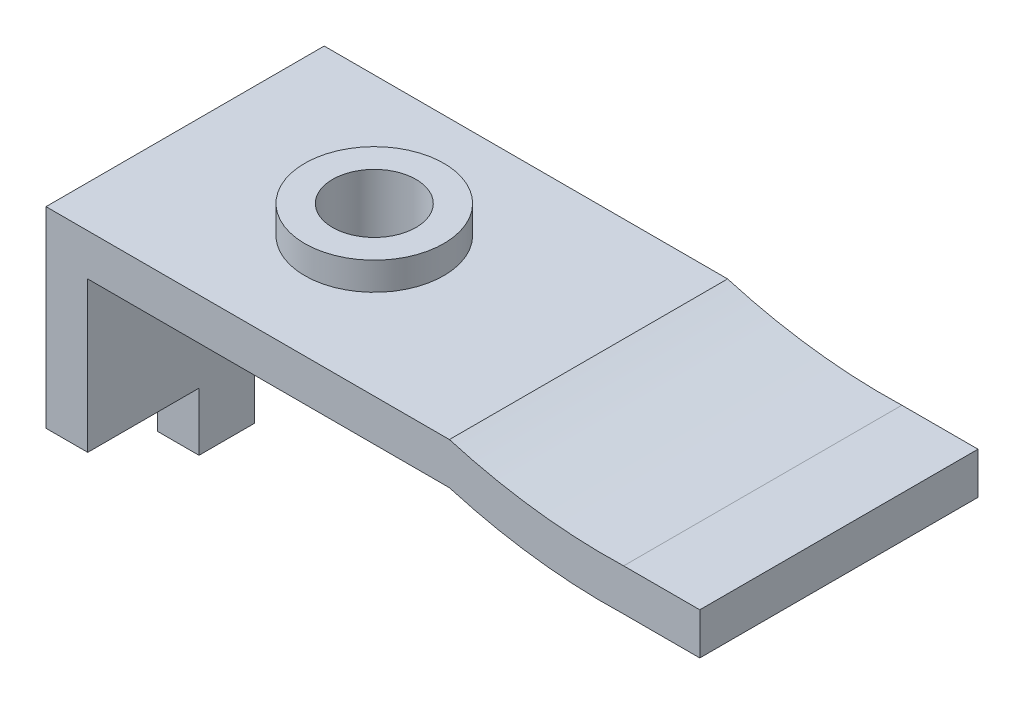
ISO-10303-21;
HEADER;
FILE_DESCRIPTION(('STEP AP214'),'2;1');
FILE_NAME('part.step','',(''),(''),'','','');
FILE_SCHEMA(('AUTOMOTIVE_DESIGN { 1 0 10303 214 1 1 1 1 }'));
ENDSEC;
DATA;
#1=APPLICATION_CONTEXT('core data for automotive mechanical design processes');
#2=APPLICATION_PROTOCOL_DEFINITION('international standard','automotive_design',2000,#1);
#3=PRODUCT_CONTEXT('',#1,'mechanical');
#4=PRODUCT('Part','Part','',(#3));
#5=PRODUCT_RELATED_PRODUCT_CATEGORY('part','',(#4));
#6=PRODUCT_DEFINITION_FORMATION('','',#4);
#7=PRODUCT_DEFINITION_CONTEXT('part definition',#1,'design');
#8=PRODUCT_DEFINITION('design','',#6,#7);
#9=PRODUCT_DEFINITION_SHAPE('','',#8);
#10=(LENGTH_UNIT() NAMED_UNIT(*) SI_UNIT(.MILLI.,.METRE.));
#11=(NAMED_UNIT(*) PLANE_ANGLE_UNIT() SI_UNIT($,.RADIAN.));
#12=(NAMED_UNIT(*) SI_UNIT($,.STERADIAN.) SOLID_ANGLE_UNIT());
#13=UNCERTAINTY_MEASURE_WITH_UNIT(LENGTH_MEASURE(1.E-05),#10,'distance_accuracy_value','');
#14=(GEOMETRIC_REPRESENTATION_CONTEXT(3) GLOBAL_UNCERTAINTY_ASSIGNED_CONTEXT((#13)) GLOBAL_UNIT_ASSIGNED_CONTEXT((#10,
#11,#12)) REPRESENTATION_CONTEXT('',''));
#15=CARTESIAN_POINT('',(0.,0.,0.));
#16=DIRECTION('',(0.,0.,1.));
#17=DIRECTION('',(1.,0.,0.));
#18=AXIS2_PLACEMENT_3D('',#15,#16,#17);
#19=CARTESIAN_POINT('',(-17.31178038599,-2.3,0.));
#20=DIRECTION('',(1.,0.,0.));
#21=DIRECTION('',(0.,0.,-1.));
#22=AXIS2_PLACEMENT_3D('',#19,#20,#21);
#23=PLANE('',#22);
#24=DIRECTION('',(0.,0.,-1.));
#25=VECTOR('',#24,1.);
#26=CARTESIAN_POINT('',(-17.31178038599,-2.3,0.));
#27=LINE('',#26,#25);
#28=CARTESIAN_POINT('',(-17.31178038599,-2.3,0.));
#29=VERTEX_POINT('',#28);
#30=CARTESIAN_POINT('',(-17.31178038599,-2.3,10.));
#31=VERTEX_POINT('',#30);
#32=EDGE_CURVE('E174',#29,#31,#27,.F.);
#33=ORIENTED_EDGE('',*,*,#32,.F.);
#34=DIRECTION('',(0.,1.,0.));
#35=VECTOR('',#34,1.);
#36=CARTESIAN_POINT('',(-17.31178038599,-2.3,0.));
#37=LINE('',#36,#35);
#38=CARTESIAN_POINT('',(-17.31178038599,-0.8,0.));
#39=VERTEX_POINT('',#38);
#40=EDGE_CURVE('E134',#29,#39,#37,.T.);
#41=ORIENTED_EDGE('',*,*,#40,.T.);
#42=DIRECTION('',(0.,0.,1.));
#43=VECTOR('',#42,1.);
#44=CARTESIAN_POINT('',(-17.31178038599,-0.8,0.));
#45=LINE('',#44,#43);
#46=CARTESIAN_POINT('',(-17.31178038599,-0.8,10.));
#47=VERTEX_POINT('',#46);
#48=EDGE_CURVE('E137',#47,#39,#45,.F.);
#49=ORIENTED_EDGE('',*,*,#48,.F.);
#50=DIRECTION('',(0.,1.,0.));
#51=VECTOR('',#50,1.);
#52=CARTESIAN_POINT('',(-17.31178038599,-2.3,10.));
#53=LINE('',#52,#51);
#54=EDGE_CURVE('E121',#47,#31,#53,.F.);
#55=ORIENTED_EDGE('',*,*,#54,.T.);
#56=EDGE_LOOP('',(#33,#41,#49,#55));
#57=FACE_BOUND('',#56,.T.);
#58=ADVANCED_FACE('F17',(#57),#23,.T.);
#59=CARTESIAN_POINT('',(-34.01178038599,0.,5.));
#60=DIRECTION('',(0.,1.,0.));
#61=DIRECTION('',(0.,0.,1.));
#62=AXIS2_PLACEMENT_3D('',#59,#60,#61);
#63=CYLINDRICAL_SURFACE('',#62,1.5);
#64=CARTESIAN_POINT('',(-34.01178038599,1.,5.));
#65=DIRECTION('',(0.,1.,0.));
#66=DIRECTION('',(0.,0.,1.));
#67=AXIS2_PLACEMENT_3D('',#64,#65,#66);
#68=CIRCLE('',#67,1.5);
#69=CARTESIAN_POINT('',(-34.01178038599,1.,6.5));
#70=VERTEX_POINT('',#69);
#71=EDGE_CURVE('E141',#70,#70,#68,.F.);
#72=ORIENTED_EDGE('',*,*,#71,.F.);
#73=EDGE_LOOP('',(#72));
#74=FACE_BOUND('',#73,.T.);
#75=CARTESIAN_POINT('',(-34.01178038599,-1.5,5.));
#76=DIRECTION('',(0.,1.,0.));
#77=DIRECTION('',(0.,0.,1.));
#78=AXIS2_PLACEMENT_3D('',#75,#76,#77);
#79=CIRCLE('',#78,1.5);
#80=CARTESIAN_POINT('',(-34.01178038599,-1.5,6.5));
#81=VERTEX_POINT('',#80);
#82=EDGE_CURVE('E20',#81,#81,#79,.T.);
#83=ORIENTED_EDGE('',*,*,#82,.F.);
#84=EDGE_LOOP('',(#83));
#85=FACE_BOUND('',#84,.T.);
#86=ADVANCED_FACE('F287',(#74,#85),#63,.F.);
#87=CARTESIAN_POINT('',(-40.81178038599,-6.9,0.));
#88=DIRECTION('',(0.,-1.,0.));
#89=DIRECTION('',(0.,0.,-1.));
#90=AXIS2_PLACEMENT_3D('',#87,#88,#89);
#91=PLANE('',#90);
#92=DIRECTION('',(0.,0.,-1.));
#93=VECTOR('',#92,1.);
#94=CARTESIAN_POINT('',(-39.31178038599,-6.9,0.));
#95=LINE('',#94,#93);
#96=CARTESIAN_POINT('',(-39.31178038599,-6.9,4.));
#97=VERTEX_POINT('',#96);
#98=CARTESIAN_POINT('',(-39.31178038599,-6.9,0.));
#99=VERTEX_POINT('',#98);
#100=EDGE_CURVE('E180',#97,#99,#95,.T.);
#101=ORIENTED_EDGE('',*,*,#100,.F.);
#102=DIRECTION('',(-1.,0.,0.));
#103=VECTOR('',#102,1.);
#104=CARTESIAN_POINT('',(-40.81178038599,-6.9,4.));
#105=LINE('',#104,#103);
#106=CARTESIAN_POINT('',(-40.81178038599,-6.9,4.));
#107=VERTEX_POINT('',#106);
#108=EDGE_CURVE('E239',#107,#97,#105,.F.);
#109=ORIENTED_EDGE('',*,*,#108,.F.);
#110=DIRECTION('',(0.,0.,1.));
#111=VECTOR('',#110,1.);
#112=CARTESIAN_POINT('',(-40.81178038599,-6.9,0.));
#113=LINE('',#112,#111);
#114=CARTESIAN_POINT('',(-40.81178038599,-6.9,0.));
#115=VERTEX_POINT('',#114);
#116=EDGE_CURVE('E194',#115,#107,#113,.T.);
#117=ORIENTED_EDGE('',*,*,#116,.F.);
#118=DIRECTION('',(1.,0.,0.));
#119=VECTOR('',#118,1.);
#120=CARTESIAN_POINT('',(-40.81178038599,-6.9,0.));
#121=LINE('',#120,#119);
#122=EDGE_CURVE('E247',#115,#99,#121,.T.);
#123=ORIENTED_EDGE('',*,*,#122,.T.);
#124=EDGE_LOOP('',(#101,#109,#117,#123));
#125=FACE_BOUND('',#124,.T.);
#126=ADVANCED_FACE('F290',(#125),#91,.T.);
#127=CARTESIAN_POINT('',(-40.81178038599,-6.9,4.));
#128=DIRECTION('',(0.,0.,-1.));
#129=DIRECTION('',(-1.,0.,0.));
#130=AXIS2_PLACEMENT_3D('',#127,#128,#129);
#131=PLANE('',#130);
#132=DIRECTION('',(0.,1.,0.));
#133=VECTOR('',#132,1.);
#134=CARTESIAN_POINT('',(-40.81178038599,0.,4.));
#135=LINE('',#134,#133);
#136=CARTESIAN_POINT('',(-40.81178038599,-8.991781939435,4.));
#137=VERTEX_POINT('',#136);
#138=EDGE_CURVE('E197',#107,#137,#135,.F.);
#139=ORIENTED_EDGE('',*,*,#138,.F.);
#140=ORIENTED_EDGE('',*,*,#108,.T.);
#141=DIRECTION('',(0.,1.,0.));
#142=VECTOR('',#141,1.);
#143=CARTESIAN_POINT('',(-39.31178038599,-6.9,4.));
#144=LINE('',#143,#142);
#145=CARTESIAN_POINT('',(-39.31178038599,-8.991781939435,4.));
#146=VERTEX_POINT('',#145);
#147=EDGE_CURVE('E191',#146,#97,#144,.T.);
#148=ORIENTED_EDGE('',*,*,#147,.F.);
#149=DIRECTION('',(1.,0.,0.));
#150=VECTOR('',#149,1.);
#151=CARTESIAN_POINT('',(-40.81178038599,-8.991781939435,4.));
#152=LINE('',#151,#150);
#153=EDGE_CURVE('E231',#137,#146,#152,.T.);
#154=ORIENTED_EDGE('',*,*,#153,.F.);
#155=EDGE_LOOP('',(#139,#140,#148,#154));
#156=FACE_BOUND('',#155,.T.);
#157=ADVANCED_FACE('F345',(#156),#131,.T.);
#158=CARTESIAN_POINT('',(-40.81178038599,-8.991781939435,4.));
#159=DIRECTION('',(0.,-1.,0.));
#160=DIRECTION('',(0.,0.,-1.));
#161=AXIS2_PLACEMENT_3D('',#158,#159,#160);
#162=PLANE('',#161);
#163=DIRECTION('',(1.,0.,0.));
#164=VECTOR('',#163,1.);
#165=CARTESIAN_POINT('',(-40.81178038599,-8.991781939435,6.));
#166=LINE('',#165,#164);
#167=CARTESIAN_POINT('',(-40.81178038599,-8.991781939435,6.));
#168=VERTEX_POINT('',#167);
#169=CARTESIAN_POINT('',(-39.31178038599,-8.991781939435,6.));
#170=VERTEX_POINT('',#169);
#171=EDGE_CURVE('E219',#168,#170,#166,.T.);
#172=ORIENTED_EDGE('',*,*,#171,.F.);
#173=DIRECTION('',(0.,0.,1.));
#174=VECTOR('',#173,1.);
#175=CARTESIAN_POINT('',(-40.81178038599,-8.991781939435,0.));
#176=LINE('',#175,#174);
#177=EDGE_CURVE('E227',#137,#168,#176,.T.);
#178=ORIENTED_EDGE('',*,*,#177,.F.);
#179=ORIENTED_EDGE('',*,*,#153,.T.);
#180=DIRECTION('',(0.,0.,-1.));
#181=VECTOR('',#180,1.);
#182=CARTESIAN_POINT('',(-39.31178038599,-8.991781939435,0.));
#183=LINE('',#182,#181);
#184=EDGE_CURVE('E260',#170,#146,#183,.T.);
#185=ORIENTED_EDGE('',*,*,#184,.F.);
#186=EDGE_LOOP('',(#172,#178,#179,#185));
#187=FACE_BOUND('',#186,.T.);
#188=ADVANCED_FACE('F349',(#187),#162,.T.);
#189=CARTESIAN_POINT('',(-40.81178038599,-8.991781939435,6.));
#190=DIRECTION('',(0.,0.,1.));
#191=DIRECTION('',(1.,0.,0.));
#192=AXIS2_PLACEMENT_3D('',#189,#190,#191);
#193=PLANE('',#192);
#194=DIRECTION('',(0.,1.,0.));
#195=VECTOR('',#194,1.);
#196=CARTESIAN_POINT('',(-39.31178038599,-6.9,6.));
#197=LINE('',#196,#195);
#198=CARTESIAN_POINT('',(-39.31178038599,-6.9,6.));
#199=VERTEX_POINT('',#198);
#200=EDGE_CURVE('E213',#199,#170,#197,.F.);
#201=ORIENTED_EDGE('',*,*,#200,.F.);
#202=DIRECTION('',(1.,0.,0.));
#203=VECTOR('',#202,1.);
#204=CARTESIAN_POINT('',(-40.81178038599,-6.9,6.));
#205=LINE('',#204,#203);
#206=CARTESIAN_POINT('',(-40.81178038599,-6.9,6.));
#207=VERTEX_POINT('',#206);
#208=EDGE_CURVE('E214',#207,#199,#205,.T.);
#209=ORIENTED_EDGE('',*,*,#208,.F.);
#210=DIRECTION('',(0.,1.,0.));
#211=VECTOR('',#210,1.);
#212=CARTESIAN_POINT('',(-40.81178038599,0.,6.));
#213=LINE('',#212,#211);
#214=EDGE_CURVE('E203',#168,#207,#213,.T.);
#215=ORIENTED_EDGE('',*,*,#214,.F.);
#216=ORIENTED_EDGE('',*,*,#171,.T.);
#217=EDGE_LOOP('',(#201,#209,#215,#216));
#218=FACE_BOUND('',#217,.T.);
#219=ADVANCED_FACE('F354',(#218),#193,.T.);
#220=CARTESIAN_POINT('',(-40.81178038599,-6.9,0.));
#221=DIRECTION('',(0.,-1.,0.));
#222=DIRECTION('',(0.,0.,-1.));
#223=AXIS2_PLACEMENT_3D('',#220,#221,#222);
#224=PLANE('',#223);
#225=DIRECTION('',(0.,0.,1.));
#226=VECTOR('',#225,1.);
#227=CARTESIAN_POINT('',(-40.81178038599,-6.9,0.));
#228=LINE('',#227,#226);
#229=CARTESIAN_POINT('',(-40.81178038599,-6.9,10.));
#230=VERTEX_POINT('',#229);
#231=EDGE_CURVE('E200',#207,#230,#228,.T.);
#232=ORIENTED_EDGE('',*,*,#231,.F.);
#233=ORIENTED_EDGE('',*,*,#208,.T.);
#234=DIRECTION('',(0.,0.,-1.));
#235=VECTOR('',#234,1.);
#236=CARTESIAN_POINT('',(-39.31178038599,-6.9,0.));
#237=LINE('',#236,#235);
#238=CARTESIAN_POINT('',(-39.31178038599,-6.9,10.));
#239=VERTEX_POINT('',#238);
#240=EDGE_CURVE('E210',#239,#199,#237,.T.);
#241=ORIENTED_EDGE('',*,*,#240,.F.);
#242=DIRECTION('',(1.,0.,0.));
#243=VECTOR('',#242,1.);
#244=CARTESIAN_POINT('',(-40.81178038599,-6.9,10.));
#245=LINE('',#244,#243);
#246=EDGE_CURVE('E217',#239,#230,#245,.F.);
#247=ORIENTED_EDGE('',*,*,#246,.T.);
#248=EDGE_LOOP('',(#232,#233,#241,#247));
#249=FACE_BOUND('',#248,.T.);
#250=ADVANCED_FACE('F357',(#249),#224,.T.);
#251=CARTESIAN_POINT('',(-39.31178038599,-6.9,0.));
#252=DIRECTION('',(1.,0.,0.));
#253=DIRECTION('',(0.,0.,-1.));
#254=AXIS2_PLACEMENT_3D('',#251,#252,#253);
#255=PLANE('',#254);
#256=ORIENTED_EDGE('',*,*,#147,.T.);
#257=ORIENTED_EDGE('',*,*,#100,.T.);
#258=DIRECTION('',(0.,1.,0.));
#259=VECTOR('',#258,1.);
#260=CARTESIAN_POINT('',(-39.31178038599,0.,0.));
#261=LINE('',#260,#259);
#262=CARTESIAN_POINT('',(-39.31178038599,-1.5,0.));
#263=VERTEX_POINT('',#262);
#264=EDGE_CURVE('E183',#99,#263,#261,.T.);
#265=ORIENTED_EDGE('',*,*,#264,.T.);
#266=DIRECTION('',(0.,0.,-1.));
#267=VECTOR('',#266,1.);
#268=CARTESIAN_POINT('',(-39.31178038599,-1.5,0.));
#269=LINE('',#268,#267);
#270=CARTESIAN_POINT('',(-39.31178038599,-1.5,10.));
#271=VERTEX_POINT('',#270);
#272=EDGE_CURVE('E73',#271,#263,#269,.T.);
#273=ORIENTED_EDGE('',*,*,#272,.F.);
#274=DIRECTION('',(0.,1.,0.));
#275=VECTOR('',#274,1.);
#276=CARTESIAN_POINT('',(-39.31178038599,0.,10.));
#277=LINE('',#276,#275);
#278=EDGE_CURVE('E163',#239,#271,#277,.T.);
#279=ORIENTED_EDGE('',*,*,#278,.F.);
#280=ORIENTED_EDGE('',*,*,#240,.T.);
#281=ORIENTED_EDGE('',*,*,#200,.T.);
#282=ORIENTED_EDGE('',*,*,#184,.T.);
#283=EDGE_LOOP('',(#256,#257,#265,#273,#279,#280,#281,#282));
#284=FACE_BOUND('',#283,.T.);
#285=ADVANCED_FACE('F297',(#284),#255,.T.);
#286=CARTESIAN_POINT('',(-39.31178038599,-1.5,0.));
#287=DIRECTION('',(0.,-1.,0.));
#288=DIRECTION('',(0.,0.,-1.));
#289=AXIS2_PLACEMENT_3D('',#286,#287,#288);
#290=PLANE('',#289);
#291=ORIENTED_EDGE('',*,*,#82,.T.);
#292=EDGE_LOOP('',(#291));
#293=FACE_BOUND('',#292,.T.);
#294=ORIENTED_EDGE('',*,*,#272,.T.);
#295=DIRECTION('',(1.,0.,0.));
#296=VECTOR('',#295,1.);
#297=CARTESIAN_POINT('',(0.,-1.5,0.));
#298=LINE('',#297,#296);
#299=CARTESIAN_POINT('',(-26.3117803859896,-1.4999999999999,0.));
#300=VERTEX_POINT('',#299);
#301=EDGE_CURVE('E185',#263,#300,#298,.T.);
#302=ORIENTED_EDGE('',*,*,#301,.T.);
#303=DIRECTION('',(0.,0.,1.));
#304=VECTOR('',#303,1.);
#305=CARTESIAN_POINT('',(-26.3117803859899,-1.49999999999979,0.));
#306=LINE('',#305,#304);
#307=CARTESIAN_POINT('',(-26.3117803859896,-1.4999999999999,10.));
#308=VERTEX_POINT('',#307);
#309=EDGE_CURVE('E62',#308,#300,#306,.F.);
#310=ORIENTED_EDGE('',*,*,#309,.F.);
#311=DIRECTION('',(1.,0.,0.));
#312=VECTOR('',#311,1.);
#313=CARTESIAN_POINT('',(0.,-1.5,10.));
#314=LINE('',#313,#312);
#315=EDGE_CURVE('E160',#271,#308,#314,.T.);
#316=ORIENTED_EDGE('',*,*,#315,.F.);
#317=EDGE_LOOP('',(#294,#302,#310,#316));
#318=FACE_BOUND('',#317,.T.);
#319=ADVANCED_FACE('F294',(#293,#318),#290,.T.);
#320=CARTESIAN_POINT('',(-20.67789423593,17.69008407611,0.));
#321=DIRECTION('',(0.,0.,1.));
#322=DIRECTION('',(1.,0.,0.));
#323=AXIS2_PLACEMENT_3D('',#320,#321,#322);
#324=CYLINDRICAL_SURFACE('',#323,20.);
#325=ORIENTED_EDGE('',*,*,#309,.T.);
#326=CARTESIAN_POINT('',(-20.67789423593,17.69008407611,0.));
#327=DIRECTION('',(0.,0.,1.));
#328=DIRECTION('',(1.,0.,0.));
#329=AXIS2_PLACEMENT_3D('',#326,#327,#328);
#330=CIRCLE('',#329,20.);
#331=CARTESIAN_POINT('',(-20.0481811027683,-2.3,0.));
#332=VERTEX_POINT('',#331);
#333=EDGE_CURVE('E277',#300,#332,#330,.T.);
#334=ORIENTED_EDGE('',*,*,#333,.T.);
#335=DIRECTION('',(0.,0.,-1.));
#336=VECTOR('',#335,1.);
#337=CARTESIAN_POINT('',(-20.04818110275,-2.3,0.));
#338=LINE('',#337,#336);
#339=CARTESIAN_POINT('',(-20.0481811027683,-2.3,10.));
#340=VERTEX_POINT('',#339);
#341=EDGE_CURVE('E142',#340,#332,#338,.T.);
#342=ORIENTED_EDGE('',*,*,#341,.F.);
#343=CARTESIAN_POINT('',(-20.67789423593,17.69008407611,10.));
#344=DIRECTION('',(0.,0.,1.));
#345=DIRECTION('',(1.,0.,0.));
#346=AXIS2_PLACEMENT_3D('',#343,#344,#345);
#347=CIRCLE('',#346,20.);
#348=EDGE_CURVE('E150',#308,#340,#347,.T.);
#349=ORIENTED_EDGE('',*,*,#348,.F.);
#350=EDGE_LOOP('',(#325,#334,#342,#349));
#351=FACE_BOUND('',#350,.T.);
#352=ADVANCED_FACE('F296',(#351),#324,.T.);
#353=CARTESIAN_POINT('',(-20.04818110275,-2.3,0.));
#354=DIRECTION('',(0.,-1.,0.));
#355=DIRECTION('',(0.,0.,-1.));
#356=AXIS2_PLACEMENT_3D('',#353,#354,#355);
#357=PLANE('',#356);
#358=ORIENTED_EDGE('',*,*,#341,.T.);
#359=DIRECTION('',(1.,0.,0.));
#360=VECTOR('',#359,1.);
#361=CARTESIAN_POINT('',(0.,-2.3,0.));
#362=LINE('',#361,#360);
#363=EDGE_CURVE('E279',#332,#29,#362,.T.);
#364=ORIENTED_EDGE('',*,*,#363,.T.);
#365=ORIENTED_EDGE('',*,*,#32,.T.);
#366=DIRECTION('',(1.,0.,0.));
#367=VECTOR('',#366,1.);
#368=CARTESIAN_POINT('',(0.,-2.3,10.));
#369=LINE('',#368,#367);
#370=EDGE_CURVE('E130',#340,#31,#369,.T.);
#371=ORIENTED_EDGE('',*,*,#370,.F.);
#372=EDGE_LOOP('',(#358,#364,#365,#371));
#373=FACE_BOUND('',#372,.T.);
#374=ADVANCED_FACE('F387',(#373),#357,.T.);
#375=CARTESIAN_POINT('',(-17.31178038599,-0.8,0.));
#376=DIRECTION('',(0.,1.,0.));
#377=DIRECTION('',(0.,0.,1.));
#378=AXIS2_PLACEMENT_3D('',#375,#376,#377);
#379=PLANE('',#378);
#380=ORIENTED_EDGE('',*,*,#48,.T.);
#381=DIRECTION('',(1.,0.,0.));
#382=VECTOR('',#381,1.);
#383=CARTESIAN_POINT('',(0.,-0.8,0.));
#384=LINE('',#383,#382);
#385=CARTESIAN_POINT('',(-20.0481811027682,-0.799999999999426,0.));
#386=VERTEX_POINT('',#385);
#387=EDGE_CURVE('E276',#39,#386,#384,.F.);
#388=ORIENTED_EDGE('',*,*,#387,.T.);
#389=DIRECTION('',(0.,0.,1.));
#390=VECTOR('',#389,1.);
#391=CARTESIAN_POINT('',(-20.04818110275,-0.799999999998854,0.));
#392=LINE('',#391,#390);
#393=CARTESIAN_POINT('',(-20.0481811027682,-0.799999999999426,10.));
#394=VERTEX_POINT('',#393);
#395=EDGE_CURVE('E145',#386,#394,#392,.T.);
#396=ORIENTED_EDGE('',*,*,#395,.T.);
#397=DIRECTION('',(1.,0.,0.));
#398=VECTOR('',#397,1.);
#399=CARTESIAN_POINT('',(0.,-0.8,10.));
#400=LINE('',#399,#398);
#401=EDGE_CURVE('E126',#47,#394,#400,.F.);
#402=ORIENTED_EDGE('',*,*,#401,.F.);
#403=EDGE_LOOP('',(#380,#388,#396,#402));
#404=FACE_BOUND('',#403,.T.);
#405=ADVANCED_FACE('F144',(#404),#379,.T.);
#406=CARTESIAN_POINT('',(0.,1.,0.));
#407=DIRECTION('',(0.,1.,0.));
#408=DIRECTION('',(0.,0.,1.));
#409=AXIS2_PLACEMENT_3D('',#406,#407,#408);
#410=PLANE('',#409);
#411=ORIENTED_EDGE('',*,*,#71,.T.);
#412=EDGE_LOOP('',(#411));
#413=FACE_BOUND('',#412,.T.);
#414=CARTESIAN_POINT('',(-34.01178038599,1.,5.));
#415=DIRECTION('',(0.,1.,0.));
#416=DIRECTION('',(0.,0.,1.));
#417=AXIS2_PLACEMENT_3D('',#414,#415,#416);
#418=CIRCLE('',#417,2.5);
#419=CARTESIAN_POINT('',(-34.01178038599,1.,7.5));
#420=VERTEX_POINT('',#419);
#421=EDGE_CURVE('E271',#420,#420,#418,.F.);
#422=ORIENTED_EDGE('',*,*,#421,.F.);
#423=EDGE_LOOP('',(#422));
#424=FACE_BOUND('',#423,.T.);
#425=ADVANCED_FACE('F284',(#413,#424),#410,.T.);
#426=CARTESIAN_POINT('',(-40.81178038599,0.,0.));
#427=DIRECTION('',(-1.,0.,0.));
#428=DIRECTION('',(0.,0.,1.));
#429=AXIS2_PLACEMENT_3D('',#426,#427,#428);
#430=PLANE('',#429);
#431=ORIENTED_EDGE('',*,*,#214,.T.);
#432=ORIENTED_EDGE('',*,*,#231,.T.);
#433=DIRECTION('',(0.,1.,0.));
#434=VECTOR('',#433,1.);
#435=CARTESIAN_POINT('',(-40.81178038599,0.,10.));
#436=LINE('',#435,#434);
#437=CARTESIAN_POINT('',(-40.81178038599,0.,10.));
#438=VERTEX_POINT('',#437);
#439=EDGE_CURVE('E146',#438,#230,#436,.F.);
#440=ORIENTED_EDGE('',*,*,#439,.F.);
#441=DIRECTION('',(0.,0.,1.));
#442=VECTOR('',#441,1.);
#443=CARTESIAN_POINT('',(-40.81178038599,0.,0.));
#444=LINE('',#443,#442);
#445=CARTESIAN_POINT('',(-40.81178038599,0.,0.));
#446=VERTEX_POINT('',#445);
#447=EDGE_CURVE('E274',#446,#438,#444,.T.);
#448=ORIENTED_EDGE('',*,*,#447,.F.);
#449=DIRECTION('',(0.,1.,0.));
#450=VECTOR('',#449,1.);
#451=CARTESIAN_POINT('',(-40.81178038599,0.,0.));
#452=LINE('',#451,#450);
#453=EDGE_CURVE('E186',#446,#115,#452,.F.);
#454=ORIENTED_EDGE('',*,*,#453,.T.);
#455=ORIENTED_EDGE('',*,*,#116,.T.);
#456=ORIENTED_EDGE('',*,*,#138,.T.);
#457=ORIENTED_EDGE('',*,*,#177,.T.);
#458=EDGE_LOOP('',(#431,#432,#440,#448,#454,#455,#456,#457));
#459=FACE_BOUND('',#458,.T.);
#460=ADVANCED_FACE('F339',(#459),#430,.T.);
#461=CARTESIAN_POINT('',(0.,0.,10.));
#462=DIRECTION('',(0.,0.,1.));
#463=DIRECTION('',(1.,0.,0.));
#464=AXIS2_PLACEMENT_3D('',#461,#462,#463);
#465=PLANE('',#464);
#466=DIRECTION('',(1.,0.,0.));
#467=VECTOR('',#466,1.);
#468=CARTESIAN_POINT('',(-26.31178038599,0.,10.));
#469=LINE('',#468,#467);
#470=CARTESIAN_POINT('',(-26.3117803859896,0.,10.));
#471=VERTEX_POINT('',#470);
#472=EDGE_CURVE('E315',#438,#471,#469,.T.);
#473=ORIENTED_EDGE('',*,*,#472,.F.);
#474=ORIENTED_EDGE('',*,*,#439,.T.);
#475=ORIENTED_EDGE('',*,*,#246,.F.);
#476=ORIENTED_EDGE('',*,*,#278,.T.);
#477=ORIENTED_EDGE('',*,*,#315,.T.);
#478=ORIENTED_EDGE('',*,*,#348,.T.);
#479=ORIENTED_EDGE('',*,*,#370,.T.);
#480=ORIENTED_EDGE('',*,*,#54,.F.);
#481=ORIENTED_EDGE('',*,*,#401,.T.);
#482=CARTESIAN_POINT('',(-20.67789423593,19.19008407611,10.));
#483=DIRECTION('',(0.,0.,1.));
#484=DIRECTION('',(1.,0.,0.));
#485=AXIS2_PLACEMENT_3D('',#482,#483,#484);
#486=CIRCLE('',#485,20.);
#487=EDGE_CURVE('E168',#394,#471,#486,.F.);
#488=ORIENTED_EDGE('',*,*,#487,.T.);
#489=EDGE_LOOP('',(#473,#474,#475,#476,#477,#478,#479,#480,#481,#488));
#490=FACE_BOUND('',#489,.T.);
#491=ADVANCED_FACE('F124',(#490),#465,.T.);
#492=CARTESIAN_POINT('',(-20.67789423593,19.19008407611,0.));
#493=DIRECTION('',(0.,0.,1.));
#494=DIRECTION('',(1.,0.,0.));
#495=AXIS2_PLACEMENT_3D('',#492,#493,#494);
#496=CYLINDRICAL_SURFACE('',#495,20.);
#497=ORIENTED_EDGE('',*,*,#487,.F.);
#498=ORIENTED_EDGE('',*,*,#395,.F.);
#499=CARTESIAN_POINT('',(-20.67789423593,19.19008407611,0.));
#500=DIRECTION('',(0.,0.,1.));
#501=DIRECTION('',(1.,0.,0.));
#502=AXIS2_PLACEMENT_3D('',#499,#500,#501);
#503=CIRCLE('',#502,20.);
#504=CARTESIAN_POINT('',(-26.3117803859896,0.,0.));
#505=VERTEX_POINT('',#504);
#506=EDGE_CURVE('E35',#386,#505,#503,.F.);
#507=ORIENTED_EDGE('',*,*,#506,.T.);
#508=DIRECTION('',(0.,0.,1.));
#509=VECTOR('',#508,1.);
#510=CARTESIAN_POINT('',(-26.31178038599,0.,0.));
#511=LINE('',#510,#509);
#512=EDGE_CURVE('E312',#471,#505,#511,.F.);
#513=ORIENTED_EDGE('',*,*,#512,.F.);
#514=EDGE_LOOP('',(#497,#498,#507,#513));
#515=FACE_BOUND('',#514,.T.);
#516=ADVANCED_FACE('F337',(#515),#496,.F.);
#517=CARTESIAN_POINT('',(0.,0.,0.));
#518=DIRECTION('',(0.,0.,1.));
#519=DIRECTION('',(1.,0.,0.));
#520=AXIS2_PLACEMENT_3D('',#517,#518,#519);
#521=PLANE('',#520);
#522=ORIENTED_EDGE('',*,*,#506,.F.);
#523=ORIENTED_EDGE('',*,*,#387,.F.);
#524=ORIENTED_EDGE('',*,*,#40,.F.);
#525=ORIENTED_EDGE('',*,*,#363,.F.);
#526=ORIENTED_EDGE('',*,*,#333,.F.);
#527=ORIENTED_EDGE('',*,*,#301,.F.);
#528=ORIENTED_EDGE('',*,*,#264,.F.);
#529=ORIENTED_EDGE('',*,*,#122,.F.);
#530=ORIENTED_EDGE('',*,*,#453,.F.);
#531=DIRECTION('',(1.,0.,0.));
#532=VECTOR('',#531,1.);
#533=CARTESIAN_POINT('',(-26.31178038599,0.,0.));
#534=LINE('',#533,#532);
#535=EDGE_CURVE('E26',#505,#446,#534,.F.);
#536=ORIENTED_EDGE('',*,*,#535,.F.);
#537=EDGE_LOOP('',(#522,#523,#524,#525,#526,#527,#528,#529,#530,#536));
#538=FACE_BOUND('',#537,.T.);
#539=ADVANCED_FACE('F303',(#538),#521,.F.);
#540=CARTESIAN_POINT('',(-34.01178038599,0.,5.));
#541=DIRECTION('',(0.,1.,0.));
#542=DIRECTION('',(0.,0.,1.));
#543=AXIS2_PLACEMENT_3D('',#540,#541,#542);
#544=CYLINDRICAL_SURFACE('',#543,2.5);
#545=ORIENTED_EDGE('',*,*,#421,.T.);
#546=EDGE_LOOP('',(#545));
#547=FACE_BOUND('',#546,.T.);
#548=CARTESIAN_POINT('',(-34.01178038599,0.,5.));
#549=DIRECTION('',(0.,1.,0.));
#550=DIRECTION('',(0.,0.,1.));
#551=AXIS2_PLACEMENT_3D('',#548,#549,#550);
#552=CIRCLE('',#551,2.5);
#553=CARTESIAN_POINT('',(-34.01178038599,0.,7.5));
#554=VERTEX_POINT('',#553);
#555=EDGE_CURVE('E11',#554,#554,#552,.F.);
#556=ORIENTED_EDGE('',*,*,#555,.F.);
#557=EDGE_LOOP('',(#556));
#558=FACE_BOUND('',#557,.T.);
#559=ADVANCED_FACE('F366',(#547,#558),#544,.T.);
#560=CARTESIAN_POINT('',(-26.31178038599,0.,0.));
#561=DIRECTION('',(0.,1.,0.));
#562=DIRECTION('',(0.,0.,1.));
#563=AXIS2_PLACEMENT_3D('',#560,#561,#562);
#564=PLANE('',#563);
#565=ORIENTED_EDGE('',*,*,#555,.T.);
#566=EDGE_LOOP('',(#565));
#567=FACE_BOUND('',#566,.T.);
#568=ORIENTED_EDGE('',*,*,#512,.T.);
#569=ORIENTED_EDGE('',*,*,#535,.T.);
#570=ORIENTED_EDGE('',*,*,#447,.T.);
#571=ORIENTED_EDGE('',*,*,#472,.T.);
#572=EDGE_LOOP('',(#568,#569,#570,#571));
#573=FACE_BOUND('',#572,.T.);
#574=ADVANCED_FACE('F329',(#567,#573),#564,.T.);
#575=CLOSED_SHELL('',(#58,#86,#126,#157,#188,#219,#250,#285,#319,#352,#374,#405,#425,#460,#491,
#516,#539,#559,#574));
#576=MANIFOLD_SOLID_BREP('B1',#575);
#577=ADVANCED_BREP_SHAPE_REPRESENTATION('',(#18,#576),#14);
#578=SHAPE_DEFINITION_REPRESENTATION(#9,#577);
ENDSEC;
END-ISO-10303-21;
